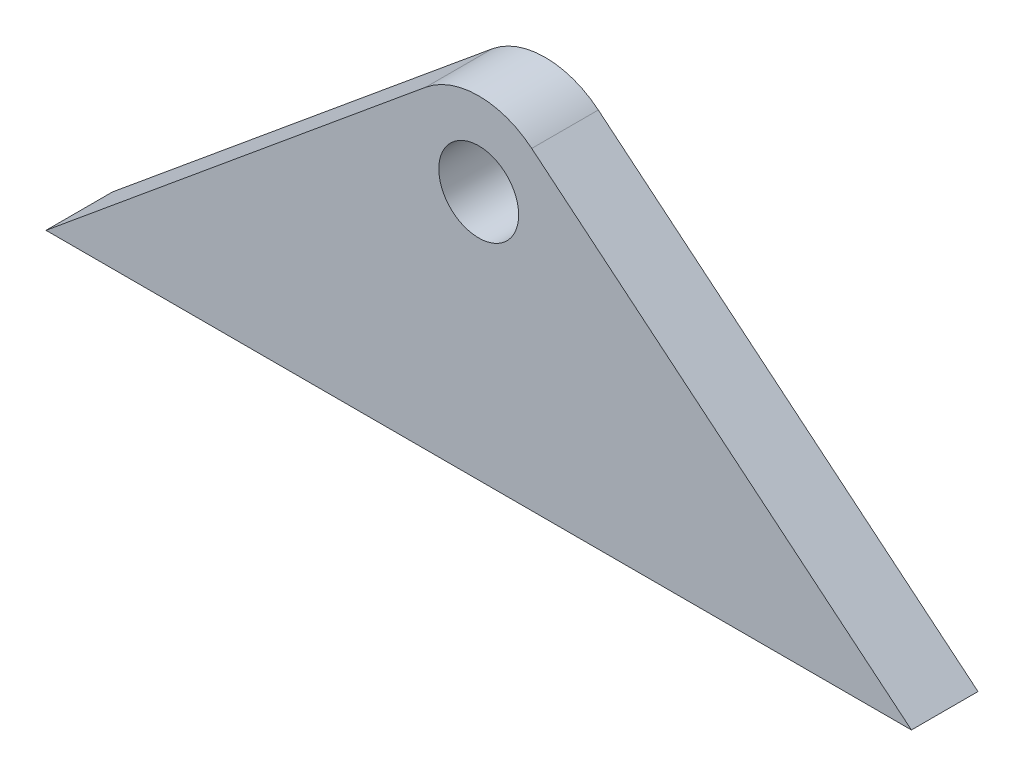
ISO-10303-21;
HEADER;
FILE_DESCRIPTION(('STEP AP214'),'2;1');
FILE_NAME('part.step','',(''),(''),'','','');
FILE_SCHEMA(('AUTOMOTIVE_DESIGN { 1 0 10303 214 1 1 1 1 }'));
ENDSEC;
DATA;
#1=APPLICATION_CONTEXT('core data for automotive mechanical design processes');
#2=APPLICATION_PROTOCOL_DEFINITION('international standard','automotive_design',2000,#1);
#3=PRODUCT_CONTEXT('',#1,'mechanical');
#4=PRODUCT('Part','Part','',(#3));
#5=PRODUCT_RELATED_PRODUCT_CATEGORY('part','',(#4));
#6=PRODUCT_DEFINITION_FORMATION('','',#4);
#7=PRODUCT_DEFINITION_CONTEXT('part definition',#1,'design');
#8=PRODUCT_DEFINITION('design','',#6,#7);
#9=PRODUCT_DEFINITION_SHAPE('','',#8);
#10=(LENGTH_UNIT() NAMED_UNIT(*) SI_UNIT(.MILLI.,.METRE.));
#11=(NAMED_UNIT(*) PLANE_ANGLE_UNIT() SI_UNIT($,.RADIAN.));
#12=(NAMED_UNIT(*) SI_UNIT($,.STERADIAN.) SOLID_ANGLE_UNIT());
#13=UNCERTAINTY_MEASURE_WITH_UNIT(LENGTH_MEASURE(1.E-05),#10,'distance_accuracy_value','');
#14=(GEOMETRIC_REPRESENTATION_CONTEXT(3) GLOBAL_UNCERTAINTY_ASSIGNED_CONTEXT((#13)) GLOBAL_UNIT_ASSIGNED_CONTEXT((#10,
#11,#12)) REPRESENTATION_CONTEXT('',''));
#15=CARTESIAN_POINT('',(0.,0.,0.));
#16=DIRECTION('',(0.,0.,1.));
#17=DIRECTION('',(1.,0.,0.));
#18=AXIS2_PLACEMENT_3D('',#15,#16,#17);
#19=CARTESIAN_POINT('',(0.,75.,10.));
#20=DIRECTION('',(0.,0.,1.));
#21=DIRECTION('',(1.,0.,0.));
#22=AXIS2_PLACEMENT_3D('',#19,#20,#21);
#23=PLANE('',#22);
#24=DIRECTION('',(-0.770843203686276,0.637024925203621,0.));
#25=VECTOR('',#24,1.);
#26=CARTESIAN_POINT('',(130.,0.,10.));
#27=LINE('',#26,#25);
#28=CARTESIAN_POINT('',(130.,0.,10.));
#29=VERTEX_POINT('',#28);
#30=CARTESIAN_POINT('',(15.9256231300905,94.2710800921569,10.));
#31=VERTEX_POINT('',#30);
#32=EDGE_CURVE('E92',#29,#31,#27,.T.);
#33=ORIENTED_EDGE('',*,*,#32,.T.);
#34=CARTESIAN_POINT('',(0.,75.,10.));
#35=DIRECTION('',(0.,0.,1.));
#36=DIRECTION('',(1.,0.,0.));
#37=AXIS2_PLACEMENT_3D('',#34,#35,#36);
#38=CIRCLE('',#37,25.);
#39=CARTESIAN_POINT('',(-15.9256231300905,94.2710800921569,10.));
#40=VERTEX_POINT('',#39);
#41=EDGE_CURVE('E87',#31,#40,#38,.T.);
#42=ORIENTED_EDGE('',*,*,#41,.T.);
#43=DIRECTION('',(-0.770843203686276,-0.637024925203621,0.));
#44=VECTOR('',#43,1.);
#45=CARTESIAN_POINT('',(-130.,0.,10.));
#46=LINE('',#45,#44);
#47=CARTESIAN_POINT('',(-130.,0.,10.));
#48=VERTEX_POINT('',#47);
#49=EDGE_CURVE('E90',#40,#48,#46,.T.);
#50=ORIENTED_EDGE('',*,*,#49,.T.);
#51=DIRECTION('',(1.,0.,0.));
#52=VECTOR('',#51,1.);
#53=CARTESIAN_POINT('',(130.,0.,10.));
#54=LINE('',#53,#52);
#55=EDGE_CURVE('E57',#48,#29,#54,.T.);
#56=ORIENTED_EDGE('',*,*,#55,.T.);
#57=EDGE_LOOP('',(#33,#42,#50,#56));
#58=FACE_BOUND('',#57,.T.);
#59=CARTESIAN_POINT('',(0.,75.,10.));
#60=DIRECTION('',(0.,0.,1.));
#61=DIRECTION('',(1.,0.,0.));
#62=AXIS2_PLACEMENT_3D('',#59,#60,#61);
#63=CIRCLE('',#62,12.);
#64=CARTESIAN_POINT('',(12.,75.,10.));
#65=VERTEX_POINT('',#64);
#66=EDGE_CURVE('E112',#65,#65,#63,.T.);
#67=ORIENTED_EDGE('',*,*,#66,.F.);
#68=EDGE_LOOP('',(#67));
#69=FACE_BOUND('',#68,.T.);
#70=ADVANCED_FACE('F39',(#58,#69),#23,.T.);
#71=CARTESIAN_POINT('',(0.,75.,-10.));
#72=DIRECTION('',(0.,0.,1.));
#73=DIRECTION('',(1.,0.,0.));
#74=AXIS2_PLACEMENT_3D('',#71,#72,#73);
#75=PLANE('',#74);
#76=DIRECTION('',(-0.770843203686276,0.637024925203621,0.));
#77=VECTOR('',#76,1.);
#78=CARTESIAN_POINT('',(130.,0.,-10.));
#79=LINE('',#78,#77);
#80=CARTESIAN_POINT('',(130.,0.,-10.));
#81=VERTEX_POINT('',#80);
#82=CARTESIAN_POINT('',(15.9256231300905,94.2710800921569,-10.));
#83=VERTEX_POINT('',#82);
#84=EDGE_CURVE('E108',#81,#83,#79,.T.);
#85=ORIENTED_EDGE('',*,*,#84,.F.);
#86=DIRECTION('',(1.,0.,0.));
#87=VECTOR('',#86,1.);
#88=CARTESIAN_POINT('',(130.,0.,-10.));
#89=LINE('',#88,#87);
#90=CARTESIAN_POINT('',(-130.,0.,-10.));
#91=VERTEX_POINT('',#90);
#92=EDGE_CURVE('E80',#91,#81,#89,.T.);
#93=ORIENTED_EDGE('',*,*,#92,.F.);
#94=DIRECTION('',(-0.770843203686276,-0.637024925203621,0.));
#95=VECTOR('',#94,1.);
#96=CARTESIAN_POINT('',(-130.,0.,-10.));
#97=LINE('',#96,#95);
#98=CARTESIAN_POINT('',(-15.9256231300905,94.2710800921569,-10.));
#99=VERTEX_POINT('',#98);
#100=EDGE_CURVE('E74',#99,#91,#97,.T.);
#101=ORIENTED_EDGE('',*,*,#100,.F.);
#102=CARTESIAN_POINT('',(0.,75.,-10.));
#103=DIRECTION('',(0.,0.,1.));
#104=DIRECTION('',(1.,0.,0.));
#105=AXIS2_PLACEMENT_3D('',#102,#103,#104);
#106=CIRCLE('',#105,25.);
#107=EDGE_CURVE('E97',#83,#99,#106,.T.);
#108=ORIENTED_EDGE('',*,*,#107,.F.);
#109=EDGE_LOOP('',(#85,#93,#101,#108));
#110=FACE_BOUND('',#109,.T.);
#111=CARTESIAN_POINT('',(0.,75.,-10.));
#112=DIRECTION('',(0.,0.,1.));
#113=DIRECTION('',(1.,0.,0.));
#114=AXIS2_PLACEMENT_3D('',#111,#112,#113);
#115=CIRCLE('',#114,12.);
#116=CARTESIAN_POINT('',(12.,75.,-10.));
#117=VERTEX_POINT('',#116);
#118=EDGE_CURVE('E130',#117,#117,#115,.T.);
#119=ORIENTED_EDGE('',*,*,#118,.T.);
#120=EDGE_LOOP('',(#119));
#121=FACE_BOUND('',#120,.T.);
#122=ADVANCED_FACE('F125',(#110,#121),#75,.F.);
#123=CARTESIAN_POINT('',(130.,0.,10.));
#124=DIRECTION('',(-0.637024925203621,-0.770843203686276,0.));
#125=DIRECTION('',(0.770843203686276,-0.637024925203621,0.));
#126=AXIS2_PLACEMENT_3D('',#123,#124,#125);
#127=PLANE('',#126);
#128=ORIENTED_EDGE('',*,*,#84,.T.);
#129=DIRECTION('',(0.,0.,-1.));
#130=VECTOR('',#129,1.);
#131=CARTESIAN_POINT('',(15.9256231300905,94.2710800921569,10.));
#132=LINE('',#131,#130);
#133=EDGE_CURVE('E11',#31,#83,#132,.T.);
#134=ORIENTED_EDGE('',*,*,#133,.F.);
#135=ORIENTED_EDGE('',*,*,#32,.F.);
#136=DIRECTION('',(0.,0.,-1.));
#137=VECTOR('',#136,1.);
#138=CARTESIAN_POINT('',(130.,0.,10.));
#139=LINE('',#138,#137);
#140=EDGE_CURVE('E104',#29,#81,#139,.T.);
#141=ORIENTED_EDGE('',*,*,#140,.T.);
#142=EDGE_LOOP('',(#128,#134,#135,#141));
#143=FACE_BOUND('',#142,.T.);
#144=ADVANCED_FACE('F41',(#143),#127,.F.);
#145=CARTESIAN_POINT('',(0.,75.,10.));
#146=DIRECTION('',(0.,0.,-1.));
#147=DIRECTION('',(-1.,0.,0.));
#148=AXIS2_PLACEMENT_3D('',#145,#146,#147);
#149=CYLINDRICAL_SURFACE('',#148,25.);
#150=ORIENTED_EDGE('',*,*,#107,.T.);
#151=DIRECTION('',(0.,0.,-1.));
#152=VECTOR('',#151,1.);
#153=CARTESIAN_POINT('',(-15.9256231300905,94.2710800921569,10.));
#154=LINE('',#153,#152);
#155=EDGE_CURVE('E49',#40,#99,#154,.T.);
#156=ORIENTED_EDGE('',*,*,#155,.F.);
#157=ORIENTED_EDGE('',*,*,#41,.F.);
#158=ORIENTED_EDGE('',*,*,#133,.T.);
#159=EDGE_LOOP('',(#150,#156,#157,#158));
#160=FACE_BOUND('',#159,.T.);
#161=ADVANCED_FACE('F96',(#160),#149,.T.);
#162=CARTESIAN_POINT('',(-130.,0.,10.));
#163=DIRECTION('',(0.637024925203621,-0.770843203686276,0.));
#164=DIRECTION('',(0.770843203686276,0.637024925203621,0.));
#165=AXIS2_PLACEMENT_3D('',#162,#163,#164);
#166=PLANE('',#165);
#167=ORIENTED_EDGE('',*,*,#100,.T.);
#168=DIRECTION('',(0.,0.,-1.));
#169=VECTOR('',#168,1.);
#170=CARTESIAN_POINT('',(-130.,0.,10.));
#171=LINE('',#170,#169);
#172=EDGE_CURVE('E99',#48,#91,#171,.T.);
#173=ORIENTED_EDGE('',*,*,#172,.F.);
#174=ORIENTED_EDGE('',*,*,#49,.F.);
#175=ORIENTED_EDGE('',*,*,#155,.T.);
#176=EDGE_LOOP('',(#167,#173,#174,#175));
#177=FACE_BOUND('',#176,.T.);
#178=ADVANCED_FACE('F100',(#177),#166,.F.);
#179=CARTESIAN_POINT('',(130.,0.,10.));
#180=DIRECTION('',(0.,1.,0.));
#181=DIRECTION('',(0.,0.,1.));
#182=AXIS2_PLACEMENT_3D('',#179,#180,#181);
#183=PLANE('',#182);
#184=ORIENTED_EDGE('',*,*,#92,.T.);
#185=ORIENTED_EDGE('',*,*,#140,.F.);
#186=ORIENTED_EDGE('',*,*,#55,.F.);
#187=ORIENTED_EDGE('',*,*,#172,.T.);
#188=EDGE_LOOP('',(#184,#185,#186,#187));
#189=FACE_BOUND('',#188,.T.);
#190=ADVANCED_FACE('F122',(#189),#183,.F.);
#191=CARTESIAN_POINT('',(0.,75.,10.));
#192=DIRECTION('',(0.,0.,-1.));
#193=DIRECTION('',(-1.,0.,0.));
#194=AXIS2_PLACEMENT_3D('',#191,#192,#193);
#195=CYLINDRICAL_SURFACE('',#194,12.);
#196=ORIENTED_EDGE('',*,*,#66,.T.);
#197=EDGE_LOOP('',(#196));
#198=FACE_BOUND('',#197,.T.);
#199=ORIENTED_EDGE('',*,*,#118,.F.);
#200=EDGE_LOOP('',(#199));
#201=FACE_BOUND('',#200,.T.);
#202=ADVANCED_FACE('F138',(#198,#201),#195,.F.);
#203=CLOSED_SHELL('',(#70,#122,#144,#161,#178,#190,#202));
#204=MANIFOLD_SOLID_BREP('B2',#203);
#205=ADVANCED_BREP_SHAPE_REPRESENTATION('',(#18,#204),#14);
#206=SHAPE_DEFINITION_REPRESENTATION(#9,#205);
ENDSEC;
END-ISO-10303-21;
